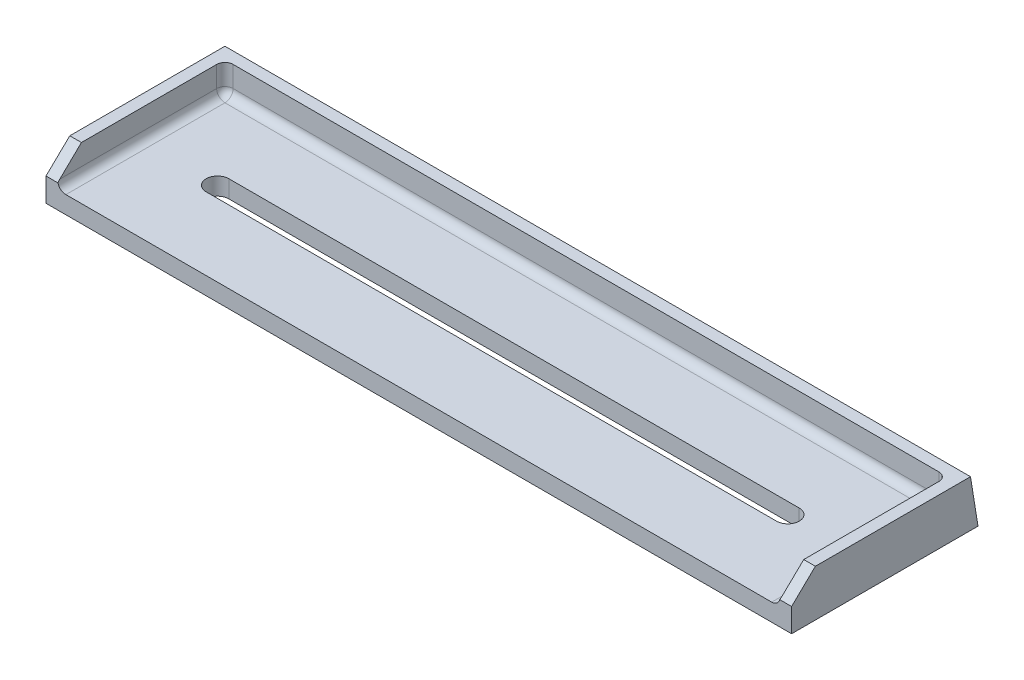
ISO-10303-21;
HEADER;
FILE_DESCRIPTION(('STEP AP214'),'2;1');
FILE_NAME('part.step','',(''),(''),'','','');
FILE_SCHEMA(('AUTOMOTIVE_DESIGN { 1 0 10303 214 1 1 1 1 }'));
ENDSEC;
DATA;
#1=APPLICATION_CONTEXT('core data for automotive mechanical design processes');
#2=APPLICATION_PROTOCOL_DEFINITION('international standard','automotive_design',2000,#1);
#3=PRODUCT_CONTEXT('',#1,'mechanical');
#4=PRODUCT('Part','Part','',(#3));
#5=PRODUCT_RELATED_PRODUCT_CATEGORY('part','',(#4));
#6=PRODUCT_DEFINITION_FORMATION('','',#4);
#7=PRODUCT_DEFINITION_CONTEXT('part definition',#1,'design');
#8=PRODUCT_DEFINITION('design','',#6,#7);
#9=PRODUCT_DEFINITION_SHAPE('','',#8);
#10=(LENGTH_UNIT() NAMED_UNIT(*) SI_UNIT(.MILLI.,.METRE.));
#11=(NAMED_UNIT(*) PLANE_ANGLE_UNIT() SI_UNIT($,.RADIAN.));
#12=(NAMED_UNIT(*) SI_UNIT($,.STERADIAN.) SOLID_ANGLE_UNIT());
#13=UNCERTAINTY_MEASURE_WITH_UNIT(LENGTH_MEASURE(1.E-05),#10,'distance_accuracy_value','');
#14=(GEOMETRIC_REPRESENTATION_CONTEXT(3) GLOBAL_UNCERTAINTY_ASSIGNED_CONTEXT((#13)) GLOBAL_UNIT_ASSIGNED_CONTEXT((#10,
#11,#12)) REPRESENTATION_CONTEXT('',''));
#15=CARTESIAN_POINT('',(0.,0.,0.));
#16=DIRECTION('',(0.,0.,1.));
#17=DIRECTION('',(1.,0.,0.));
#18=AXIS2_PLACEMENT_3D('',#15,#16,#17);
#19=CARTESIAN_POINT('',(-50.8,6.35,12.7));
#20=DIRECTION('',(1.,0.,0.));
#21=DIRECTION('',(0.,0.,-1.));
#22=AXIS2_PLACEMENT_3D('',#19,#20,#21);
#23=PLANE('',#22);
#24=DIRECTION('',(0.,-1.,0.));
#25=VECTOR('',#24,1.);
#26=CARTESIAN_POINT('',(-50.8,6.35,12.7));
#27=LINE('',#26,#25);
#28=CARTESIAN_POINT('',(-50.8,3.22326,12.7));
#29=VERTEX_POINT('',#28);
#30=CARTESIAN_POINT('',(-50.8,0.,12.7));
#31=VERTEX_POINT('',#30);
#32=EDGE_CURVE('E183',#29,#31,#27,.T.);
#33=ORIENTED_EDGE('',*,*,#32,.F.);
#34=DIRECTION('',(0.,0.694302557027958,-0.719683235392099));
#35=VECTOR('',#34,1.);
#36=CARTESIAN_POINT('',(-50.8,6.35,9.45896));
#37=LINE('',#36,#35);
#38=CARTESIAN_POINT('',(-50.8,6.35,9.45896));
#39=VERTEX_POINT('',#38);
#40=EDGE_CURVE('E254',#29,#39,#37,.T.);
#41=ORIENTED_EDGE('',*,*,#40,.T.);
#42=DIRECTION('',(0.,0.,1.));
#43=VECTOR('',#42,1.);
#44=CARTESIAN_POINT('',(-50.8,6.35,12.7));
#45=LINE('',#44,#43);
#46=CARTESIAN_POINT('',(-50.8,6.35,-11.67892));
#47=VERTEX_POINT('',#46);
#48=EDGE_CURVE('E181',#47,#39,#45,.T.);
#49=ORIENTED_EDGE('',*,*,#48,.F.);
#50=DIRECTION('',(0.,0.987317109484192,0.158760591205058));
#51=VECTOR('',#50,1.);
#52=CARTESIAN_POINT('',(-50.8,0.,-12.7));
#53=LINE('',#52,#51);
#54=CARTESIAN_POINT('',(-50.8,0.,-12.7));
#55=VERTEX_POINT('',#54);
#56=EDGE_CURVE('E298',#55,#47,#53,.T.);
#57=ORIENTED_EDGE('',*,*,#56,.F.);
#58=DIRECTION('',(0.,0.,1.));
#59=VECTOR('',#58,1.);
#60=CARTESIAN_POINT('',(-50.8,0.,12.7));
#61=LINE('',#60,#59);
#62=EDGE_CURVE('E190',#55,#31,#61,.T.);
#63=ORIENTED_EDGE('',*,*,#62,.T.);
#64=EDGE_LOOP('',(#33,#41,#49,#57,#63));
#65=FACE_BOUND('',#64,.T.);
#66=ADVANCED_FACE('F32',(#65),#23,.F.);
#67=CARTESIAN_POINT('',(50.8,6.35,12.7));
#68=DIRECTION('',(0.,0.,-1.));
#69=DIRECTION('',(-1.,0.,0.));
#70=AXIS2_PLACEMENT_3D('',#67,#68,#69);
#71=PLANE('',#70);
#72=DIRECTION('',(0.,-1.,0.));
#73=VECTOR('',#72,1.);
#74=CARTESIAN_POINT('',(50.8,6.35,12.7));
#75=LINE('',#74,#73);
#76=CARTESIAN_POINT('',(50.8,3.22326,12.7));
#77=VERTEX_POINT('',#76);
#78=CARTESIAN_POINT('',(50.8,0.,12.7));
#79=VERTEX_POINT('',#78);
#80=EDGE_CURVE('E180',#77,#79,#75,.T.);
#81=ORIENTED_EDGE('',*,*,#80,.F.);
#82=DIRECTION('',(-1.,0.,0.));
#83=VECTOR('',#82,1.);
#84=CARTESIAN_POINT('',(50.8,3.22326,12.7));
#85=LINE('',#84,#83);
#86=CARTESIAN_POINT('',(49.1765215316084,3.22326,12.7));
#87=VERTEX_POINT('',#86);
#88=EDGE_CURVE('E56',#77,#87,#85,.T.);
#89=ORIENTED_EDGE('',*,*,#88,.T.);
#90=CARTESIAN_POINT('',(48.08982,3.5052,12.7));
#91=DIRECTION('',(0.,0.,-1.));
#92=DIRECTION('',(-1.,0.,0.));
#93=AXIS2_PLACEMENT_3D('',#90,#91,#92);
#94=CIRCLE('',#93,1.12268);
#95=CARTESIAN_POINT('',(48.08982,2.38252,12.7));
#96=VERTEX_POINT('',#95);
#97=EDGE_CURVE('E226',#87,#96,#94,.T.);
#98=ORIENTED_EDGE('',*,*,#97,.T.);
#99=DIRECTION('',(1.,0.,0.));
#100=VECTOR('',#99,1.);
#101=CARTESIAN_POINT('',(-49.2125,2.38252,12.7));
#102=LINE('',#101,#100);
#103=CARTESIAN_POINT('',(-48.08982,2.38252,12.7));
#104=VERTEX_POINT('',#103);
#105=EDGE_CURVE('E295',#104,#96,#102,.T.);
#106=ORIENTED_EDGE('',*,*,#105,.F.);
#107=CARTESIAN_POINT('',(-48.08982,3.5052,12.7));
#108=DIRECTION('',(0.,0.,-1.));
#109=DIRECTION('',(-1.,0.,0.));
#110=AXIS2_PLACEMENT_3D('',#107,#108,#109);
#111=CIRCLE('',#110,1.12268);
#112=CARTESIAN_POINT('',(-49.1765215316084,3.22326,12.7));
#113=VERTEX_POINT('',#112);
#114=EDGE_CURVE('E41',#104,#113,#111,.T.);
#115=ORIENTED_EDGE('',*,*,#114,.T.);
#116=DIRECTION('',(1.,0.,0.));
#117=VECTOR('',#116,1.);
#118=CARTESIAN_POINT('',(-50.8,3.22326,12.7));
#119=LINE('',#118,#117);
#120=EDGE_CURVE('E48',#29,#113,#119,.T.);
#121=ORIENTED_EDGE('',*,*,#120,.F.);
#122=ORIENTED_EDGE('',*,*,#32,.T.);
#123=DIRECTION('',(1.,0.,0.));
#124=VECTOR('',#123,1.);
#125=CARTESIAN_POINT('',(50.8,0.,12.7));
#126=LINE('',#125,#124);
#127=EDGE_CURVE('E193',#31,#79,#126,.T.);
#128=ORIENTED_EDGE('',*,*,#127,.T.);
#129=EDGE_LOOP('',(#81,#89,#98,#106,#115,#121,#122,#128));
#130=FACE_BOUND('',#129,.T.);
#131=ADVANCED_FACE('F313',(#130),#71,.F.);
#132=CARTESIAN_POINT('',(50.8,6.35,12.7));
#133=DIRECTION('',(-1.,0.,0.));
#134=DIRECTION('',(0.,0.,1.));
#135=AXIS2_PLACEMENT_3D('',#132,#133,#134);
#136=PLANE('',#135);
#137=DIRECTION('',(0.,0.,-1.));
#138=VECTOR('',#137,1.);
#139=CARTESIAN_POINT('',(50.8,6.35,12.7));
#140=LINE('',#139,#138);
#141=CARTESIAN_POINT('',(50.8,6.35,9.45895999999999));
#142=VERTEX_POINT('',#141);
#143=CARTESIAN_POINT('',(50.8,6.35,-11.67892));
#144=VERTEX_POINT('',#143);
#145=EDGE_CURVE('E171',#142,#144,#140,.T.);
#146=ORIENTED_EDGE('',*,*,#145,.F.);
#147=DIRECTION('',(0.,-0.694302557027956,0.719683235392101));
#148=VECTOR('',#147,1.);
#149=CARTESIAN_POINT('',(50.8,6.35,9.45895999999999));
#150=LINE('',#149,#148);
#151=EDGE_CURVE('E157',#142,#77,#150,.T.);
#152=ORIENTED_EDGE('',*,*,#151,.T.);
#153=ORIENTED_EDGE('',*,*,#80,.T.);
#154=DIRECTION('',(0.,0.,-1.));
#155=VECTOR('',#154,1.);
#156=CARTESIAN_POINT('',(50.8,0.,12.7));
#157=LINE('',#156,#155);
#158=CARTESIAN_POINT('',(50.8,0.,-12.7));
#159=VERTEX_POINT('',#158);
#160=EDGE_CURVE('E197',#79,#159,#157,.T.);
#161=ORIENTED_EDGE('',*,*,#160,.T.);
#162=DIRECTION('',(0.,0.987317109484192,0.158760591205058));
#163=VECTOR('',#162,1.);
#164=CARTESIAN_POINT('',(50.8,0.,-12.7));
#165=LINE('',#164,#163);
#166=EDGE_CURVE('E179',#159,#144,#165,.T.);
#167=ORIENTED_EDGE('',*,*,#166,.T.);
#168=EDGE_LOOP('',(#146,#152,#153,#161,#167));
#169=FACE_BOUND('',#168,.T.);
#170=ADVANCED_FACE('F177',(#169),#136,.F.);
#171=CARTESIAN_POINT('',(0.,6.35,0.));
#172=DIRECTION('',(0.,1.,0.));
#173=DIRECTION('',(0.,0.,1.));
#174=AXIS2_PLACEMENT_3D('',#171,#172,#173);
#175=PLANE('',#174);
#176=DIRECTION('',(-1.,0.,0.));
#177=VECTOR('',#176,1.);
#178=CARTESIAN_POINT('',(50.8,6.35,9.45895999999999));
#179=LINE('',#178,#177);
#180=CARTESIAN_POINT('',(49.2125,6.35,9.45895999999999));
#181=VERTEX_POINT('',#180);
#182=EDGE_CURVE('E161',#142,#181,#179,.T.);
#183=ORIENTED_EDGE('',*,*,#182,.F.);
#184=ORIENTED_EDGE('',*,*,#145,.T.);
#185=DIRECTION('',(-1.,0.,0.));
#186=VECTOR('',#185,1.);
#187=CARTESIAN_POINT('',(50.8,6.35,-11.67892));
#188=LINE('',#187,#186);
#189=EDGE_CURVE('E194',#144,#47,#188,.T.);
#190=ORIENTED_EDGE('',*,*,#189,.T.);
#191=ORIENTED_EDGE('',*,*,#48,.T.);
#192=DIRECTION('',(1.,0.,0.));
#193=VECTOR('',#192,1.);
#194=CARTESIAN_POINT('',(-50.8,6.35,9.45896));
#195=LINE('',#194,#193);
#196=CARTESIAN_POINT('',(-49.2125,6.35,9.45896));
#197=VERTEX_POINT('',#196);
#198=EDGE_CURVE('E258',#39,#197,#195,.T.);
#199=ORIENTED_EDGE('',*,*,#198,.T.);
#200=DIRECTION('',(0.,0.,1.));
#201=VECTOR('',#200,1.);
#202=CARTESIAN_POINT('',(-49.2125,6.35,12.7));
#203=LINE('',#202,#201);
#204=CARTESIAN_POINT('',(-49.2125,6.35,-8.96874));
#205=VERTEX_POINT('',#204);
#206=EDGE_CURVE('E294',#205,#197,#203,.T.);
#207=ORIENTED_EDGE('',*,*,#206,.F.);
#208=CARTESIAN_POINT('',(-48.08982,6.35,-8.96874));
#209=DIRECTION('',(0.,1.,0.));
#210=DIRECTION('',(0.,0.,1.));
#211=AXIS2_PLACEMENT_3D('',#208,#209,#210);
#212=CIRCLE('',#211,1.12268);
#213=CARTESIAN_POINT('',(-48.08982,6.35,-10.09142));
#214=VERTEX_POINT('',#213);
#215=EDGE_CURVE('E228',#205,#214,#212,.F.);
#216=ORIENTED_EDGE('',*,*,#215,.T.);
#217=DIRECTION('',(-1.,0.,0.));
#218=VECTOR('',#217,1.);
#219=CARTESIAN_POINT('',(-49.2125,6.35,-10.09142));
#220=LINE('',#219,#218);
#221=CARTESIAN_POINT('',(48.08982,6.35,-10.09142));
#222=VERTEX_POINT('',#221);
#223=EDGE_CURVE('E299',#222,#214,#220,.T.);
#224=ORIENTED_EDGE('',*,*,#223,.F.);
#225=CARTESIAN_POINT('',(48.08982,6.35,-8.96874));
#226=DIRECTION('',(0.,1.,0.));
#227=DIRECTION('',(0.,0.,1.));
#228=AXIS2_PLACEMENT_3D('',#225,#226,#227);
#229=CIRCLE('',#228,1.12268);
#230=CARTESIAN_POINT('',(49.2125,6.35,-8.96874));
#231=VERTEX_POINT('',#230);
#232=EDGE_CURVE('E222',#222,#231,#229,.F.);
#233=ORIENTED_EDGE('',*,*,#232,.T.);
#234=DIRECTION('',(0.,0.,-1.));
#235=VECTOR('',#234,1.);
#236=CARTESIAN_POINT('',(49.2125,6.35,12.7));
#237=LINE('',#236,#235);
#238=EDGE_CURVE('E174',#181,#231,#237,.T.);
#239=ORIENTED_EDGE('',*,*,#238,.F.);
#240=EDGE_LOOP('',(#183,#184,#190,#191,#199,#207,#216,#224,#233,#239));
#241=FACE_BOUND('',#240,.T.);
#242=ADVANCED_FACE('F169',(#241),#175,.T.);
#243=CARTESIAN_POINT('',(0.,0.,0.));
#244=DIRECTION('',(0.,1.,0.));
#245=DIRECTION('',(0.,0.,1.));
#246=AXIS2_PLACEMENT_3D('',#243,#244,#245);
#247=PLANE('',#246);
#248=DIRECTION('',(-1.,0.,0.));
#249=VECTOR('',#248,1.);
#250=CARTESIAN_POINT('',(0.,0.,-0.278654724835411));
#251=LINE('',#250,#249);
#252=CARTESIAN_POINT('',(38.862,0.,-0.278654724835408));
#253=VERTEX_POINT('',#252);
#254=CARTESIAN_POINT('',(-38.862,0.,-0.278654724835411));
#255=VERTEX_POINT('',#254);
#256=EDGE_CURVE('E288',#253,#255,#251,.T.);
#257=ORIENTED_EDGE('',*,*,#256,.T.);
#258=CARTESIAN_POINT('',(-38.862,0.,1.27));
#259=DIRECTION('',(0.,1.,0.));
#260=DIRECTION('',(0.,0.,1.));
#261=AXIS2_PLACEMENT_3D('',#258,#259,#260);
#262=CIRCLE('',#261,1.54865472483541);
#263=CARTESIAN_POINT('',(-38.862,0.,2.81865472483541));
#264=VERTEX_POINT('',#263);
#265=EDGE_CURVE('E291',#255,#264,#262,.T.);
#266=ORIENTED_EDGE('',*,*,#265,.T.);
#267=DIRECTION('',(1.,0.,0.));
#268=VECTOR('',#267,1.);
#269=CARTESIAN_POINT('',(0.,0.,2.81865472483541));
#270=LINE('',#269,#268);
#271=CARTESIAN_POINT('',(38.862,0.,2.81865472483541));
#272=VERTEX_POINT('',#271);
#273=EDGE_CURVE('E276',#264,#272,#270,.T.);
#274=ORIENTED_EDGE('',*,*,#273,.T.);
#275=CARTESIAN_POINT('',(38.862,0.,1.27));
#276=DIRECTION('',(0.,1.,0.));
#277=DIRECTION('',(0.,0.,1.));
#278=AXIS2_PLACEMENT_3D('',#275,#276,#277);
#279=CIRCLE('',#278,1.54865472483541);
#280=EDGE_CURVE('E285',#272,#253,#279,.T.);
#281=ORIENTED_EDGE('',*,*,#280,.T.);
#282=EDGE_LOOP('',(#257,#266,#274,#281));
#283=FACE_BOUND('',#282,.T.);
#284=ORIENTED_EDGE('',*,*,#62,.F.);
#285=DIRECTION('',(-1.,0.,0.));
#286=VECTOR('',#285,1.);
#287=CARTESIAN_POINT('',(50.8,0.,-12.7));
#288=LINE('',#287,#286);
#289=EDGE_CURVE('E186',#159,#55,#288,.T.);
#290=ORIENTED_EDGE('',*,*,#289,.F.);
#291=ORIENTED_EDGE('',*,*,#160,.F.);
#292=ORIENTED_EDGE('',*,*,#127,.F.);
#293=EDGE_LOOP('',(#284,#290,#291,#292));
#294=FACE_BOUND('',#293,.T.);
#295=ADVANCED_FACE('F503',(#283,#294),#247,.F.);
#296=CARTESIAN_POINT('',(50.8,0.,-12.7));
#297=DIRECTION('',(0.,-0.158760591205058,0.987317109484192));
#298=DIRECTION('',(0.,-0.987317109484192,-0.158760591205058));
#299=AXIS2_PLACEMENT_3D('',#296,#297,#298);
#300=PLANE('',#299);
#301=ORIENTED_EDGE('',*,*,#56,.T.);
#302=ORIENTED_EDGE('',*,*,#189,.F.);
#303=ORIENTED_EDGE('',*,*,#166,.F.);
#304=ORIENTED_EDGE('',*,*,#289,.T.);
#305=EDGE_LOOP('',(#301,#302,#303,#304));
#306=FACE_BOUND('',#305,.T.);
#307=ADVANCED_FACE('F494',(#306),#300,.F.);
#308=CARTESIAN_POINT('',(-49.2125,2.38252,12.7));
#309=DIRECTION('',(-1.,0.,0.));
#310=DIRECTION('',(0.,0.,1.));
#311=AXIS2_PLACEMENT_3D('',#308,#309,#310);
#312=PLANE('',#311);
#313=DIRECTION('',(0.,0.,1.));
#314=VECTOR('',#313,1.);
#315=CARTESIAN_POINT('',(-49.2125,3.5052,-10.09142));
#316=LINE('',#315,#314);
#317=CARTESIAN_POINT('',(-49.2125,3.5052,12.4077535012185));
#318=VERTEX_POINT('',#317);
#319=CARTESIAN_POINT('',(-49.2125,3.5052,-8.96874));
#320=VERTEX_POINT('',#319);
#321=EDGE_CURVE('E218',#318,#320,#316,.F.);
#322=ORIENTED_EDGE('',*,*,#321,.T.);
#323=DIRECTION('',(0.,1.,0.));
#324=VECTOR('',#323,1.);
#325=CARTESIAN_POINT('',(-49.2125,6.35,-8.96874));
#326=LINE('',#325,#324);
#327=EDGE_CURVE('E220',#320,#205,#326,.T.);
#328=ORIENTED_EDGE('',*,*,#327,.T.);
#329=ORIENTED_EDGE('',*,*,#206,.T.);
#330=DIRECTION('',(0.,0.694302557027958,-0.719683235392099));
#331=VECTOR('',#330,1.);
#332=CARTESIAN_POINT('',(-49.2125,6.35,9.45896));
#333=LINE('',#332,#331);
#334=EDGE_CURVE('E252',#318,#197,#333,.T.);
#335=ORIENTED_EDGE('',*,*,#334,.F.);
#336=EDGE_LOOP('',(#322,#328,#329,#335));
#337=FACE_BOUND('',#336,.T.);
#338=ADVANCED_FACE('F323',(#337),#312,.F.);
#339=CARTESIAN_POINT('',(-49.2125,2.38252,-10.09142));
#340=DIRECTION('',(0.,0.,-1.));
#341=DIRECTION('',(-1.,0.,0.));
#342=AXIS2_PLACEMENT_3D('',#339,#340,#341);
#343=PLANE('',#342);
#344=DIRECTION('',(-1.,0.,0.));
#345=VECTOR('',#344,1.);
#346=CARTESIAN_POINT('',(49.2125,3.5052,-10.09142));
#347=LINE('',#346,#345);
#348=CARTESIAN_POINT('',(-48.08982,3.5052,-10.09142));
#349=VERTEX_POINT('',#348);
#350=CARTESIAN_POINT('',(48.08982,3.5052,-10.09142));
#351=VERTEX_POINT('',#350);
#352=EDGE_CURVE('E201',#349,#351,#347,.F.);
#353=ORIENTED_EDGE('',*,*,#352,.T.);
#354=DIRECTION('',(0.,1.,0.));
#355=VECTOR('',#354,1.);
#356=CARTESIAN_POINT('',(48.08982,6.35,-10.09142));
#357=LINE('',#356,#355);
#358=EDGE_CURVE('E205',#351,#222,#357,.T.);
#359=ORIENTED_EDGE('',*,*,#358,.T.);
#360=ORIENTED_EDGE('',*,*,#223,.T.);
#361=DIRECTION('',(0.,1.,0.));
#362=VECTOR('',#361,1.);
#363=CARTESIAN_POINT('',(-48.08982,2.38252,-10.09142));
#364=LINE('',#363,#362);
#365=EDGE_CURVE('E203',#214,#349,#364,.F.);
#366=ORIENTED_EDGE('',*,*,#365,.T.);
#367=EDGE_LOOP('',(#353,#359,#360,#366));
#368=FACE_BOUND('',#367,.T.);
#369=ADVANCED_FACE('F332',(#368),#343,.F.);
#370=CARTESIAN_POINT('',(49.2125,2.38252,12.7));
#371=DIRECTION('',(1.,0.,0.));
#372=DIRECTION('',(0.,0.,-1.));
#373=AXIS2_PLACEMENT_3D('',#370,#371,#372);
#374=PLANE('',#373);
#375=ORIENTED_EDGE('',*,*,#238,.T.);
#376=DIRECTION('',(0.,1.,0.));
#377=VECTOR('',#376,1.);
#378=CARTESIAN_POINT('',(49.2125,2.38252,-8.96874));
#379=LINE('',#378,#377);
#380=CARTESIAN_POINT('',(49.2125,3.5052,-8.96874));
#381=VERTEX_POINT('',#380);
#382=EDGE_CURVE('E210',#231,#381,#379,.F.);
#383=ORIENTED_EDGE('',*,*,#382,.T.);
#384=DIRECTION('',(0.,0.,-1.));
#385=VECTOR('',#384,1.);
#386=CARTESIAN_POINT('',(49.2125,3.5052,12.7));
#387=LINE('',#386,#385);
#388=CARTESIAN_POINT('',(49.2125,3.5052,12.4077535012185));
#389=VERTEX_POINT('',#388);
#390=EDGE_CURVE('E208',#381,#389,#387,.F.);
#391=ORIENTED_EDGE('',*,*,#390,.T.);
#392=DIRECTION('',(0.,-0.694302557027956,0.719683235392101));
#393=VECTOR('',#392,1.);
#394=CARTESIAN_POINT('',(49.2125,6.35,9.45895999999999));
#395=LINE('',#394,#393);
#396=EDGE_CURVE('E165',#181,#389,#395,.T.);
#397=ORIENTED_EDGE('',*,*,#396,.F.);
#398=EDGE_LOOP('',(#375,#383,#391,#397));
#399=FACE_BOUND('',#398,.T.);
#400=ADVANCED_FACE('F339',(#399),#374,.F.);
#401=CARTESIAN_POINT('',(0.,2.38252,0.));
#402=DIRECTION('',(0.,-1.,0.));
#403=DIRECTION('',(0.,0.,-1.));
#404=AXIS2_PLACEMENT_3D('',#401,#402,#403);
#405=PLANE('',#404);
#406=ORIENTED_EDGE('',*,*,#105,.T.);
#407=DIRECTION('',(0.,0.,-1.));
#408=VECTOR('',#407,1.);
#409=CARTESIAN_POINT('',(48.08982,2.38252,-10.09142));
#410=LINE('',#409,#408);
#411=CARTESIAN_POINT('',(48.08982,2.38252,-8.96874));
#412=VERTEX_POINT('',#411);
#413=EDGE_CURVE('E216',#96,#412,#410,.T.);
#414=ORIENTED_EDGE('',*,*,#413,.T.);
#415=DIRECTION('',(-1.,0.,0.));
#416=VECTOR('',#415,1.);
#417=CARTESIAN_POINT('',(-49.2125,2.38252,-8.96874));
#418=LINE('',#417,#416);
#419=CARTESIAN_POINT('',(-48.08982,2.38252,-8.96874));
#420=VERTEX_POINT('',#419);
#421=EDGE_CURVE('E212',#412,#420,#418,.T.);
#422=ORIENTED_EDGE('',*,*,#421,.T.);
#423=DIRECTION('',(0.,0.,1.));
#424=VECTOR('',#423,1.);
#425=CARTESIAN_POINT('',(-48.08982,2.38252,12.7));
#426=LINE('',#425,#424);
#427=EDGE_CURVE('E214',#420,#104,#426,.T.);
#428=ORIENTED_EDGE('',*,*,#427,.T.);
#429=EDGE_LOOP('',(#406,#414,#422,#428));
#430=FACE_BOUND('',#429,.T.);
#431=DIRECTION('',(1.,0.,0.));
#432=VECTOR('',#431,1.);
#433=CARTESIAN_POINT('',(-38.862,2.38252,2.81865472483541));
#434=LINE('',#433,#432);
#435=CARTESIAN_POINT('',(-38.862,2.38252,2.81865472483541));
#436=VERTEX_POINT('',#435);
#437=CARTESIAN_POINT('',(38.862,2.38252,2.81865472483541));
#438=VERTEX_POINT('',#437);
#439=EDGE_CURVE('E264',#436,#438,#434,.T.);
#440=ORIENTED_EDGE('',*,*,#439,.F.);
#441=CARTESIAN_POINT('',(-38.862,2.38252,1.27));
#442=DIRECTION('',(0.,1.,0.));
#443=DIRECTION('',(0.,0.,1.));
#444=AXIS2_PLACEMENT_3D('',#441,#442,#443);
#445=CIRCLE('',#444,1.54865472483541);
#446=CARTESIAN_POINT('',(-38.862,2.38252,-0.278654724835411));
#447=VERTEX_POINT('',#446);
#448=EDGE_CURVE('E261',#447,#436,#445,.T.);
#449=ORIENTED_EDGE('',*,*,#448,.F.);
#450=DIRECTION('',(-1.,0.,0.));
#451=VECTOR('',#450,1.);
#452=CARTESIAN_POINT('',(-38.862,2.38252,-0.278654724835411));
#453=LINE('',#452,#451);
#454=CARTESIAN_POINT('',(38.862,2.38252,-0.278654724835408));
#455=VERTEX_POINT('',#454);
#456=EDGE_CURVE('E270',#455,#447,#453,.T.);
#457=ORIENTED_EDGE('',*,*,#456,.F.);
#458=CARTESIAN_POINT('',(38.862,2.38252,1.27));
#459=DIRECTION('',(0.,1.,0.));
#460=DIRECTION('',(0.,0.,1.));
#461=AXIS2_PLACEMENT_3D('',#458,#459,#460);
#462=CIRCLE('',#461,1.54865472483541);
#463=EDGE_CURVE('E267',#438,#455,#462,.T.);
#464=ORIENTED_EDGE('',*,*,#463,.F.);
#465=EDGE_LOOP('',(#440,#449,#457,#464));
#466=FACE_BOUND('',#465,.T.);
#467=ADVANCED_FACE('F351',(#430,#466),#405,.F.);
#468=CARTESIAN_POINT('',(-38.862,-0.15748,1.27));
#469=DIRECTION('',(0.,1.,0.));
#470=DIRECTION('',(0.,0.,1.));
#471=AXIS2_PLACEMENT_3D('',#468,#469,#470);
#472=CYLINDRICAL_SURFACE('',#471,1.54865472483541);
#473=DIRECTION('',(0.,1.,0.));
#474=VECTOR('',#473,1.);
#475=CARTESIAN_POINT('',(-38.862,-0.15748,-0.278654724835411));
#476=LINE('',#475,#474);
#477=EDGE_CURVE('E274',#255,#447,#476,.T.);
#478=ORIENTED_EDGE('',*,*,#477,.T.);
#479=ORIENTED_EDGE('',*,*,#448,.T.);
#480=DIRECTION('',(0.,1.,0.));
#481=VECTOR('',#480,1.);
#482=CARTESIAN_POINT('',(-38.862,-0.15748,2.81865472483541));
#483=LINE('',#482,#481);
#484=EDGE_CURVE('E273',#264,#436,#483,.T.);
#485=ORIENTED_EDGE('',*,*,#484,.F.);
#486=ORIENTED_EDGE('',*,*,#265,.F.);
#487=EDGE_LOOP('',(#478,#479,#485,#486));
#488=FACE_BOUND('',#487,.T.);
#489=ADVANCED_FACE('F456',(#488),#472,.F.);
#490=CARTESIAN_POINT('',(-38.862,-0.15748,-0.278654724835411));
#491=DIRECTION('',(0.,0.,-1.));
#492=DIRECTION('',(-1.,0.,0.));
#493=AXIS2_PLACEMENT_3D('',#490,#491,#492);
#494=PLANE('',#493);
#495=DIRECTION('',(0.,1.,0.));
#496=VECTOR('',#495,1.);
#497=CARTESIAN_POINT('',(38.862,-0.15748,-0.278654724835408));
#498=LINE('',#497,#496);
#499=EDGE_CURVE('E277',#253,#455,#498,.T.);
#500=ORIENTED_EDGE('',*,*,#499,.T.);
#501=ORIENTED_EDGE('',*,*,#456,.T.);
#502=ORIENTED_EDGE('',*,*,#477,.F.);
#503=ORIENTED_EDGE('',*,*,#256,.F.);
#504=EDGE_LOOP('',(#500,#501,#502,#503));
#505=FACE_BOUND('',#504,.T.);
#506=ADVANCED_FACE('F447',(#505),#494,.F.);
#507=CARTESIAN_POINT('',(38.862,-0.15748,1.27));
#508=DIRECTION('',(0.,1.,0.));
#509=DIRECTION('',(0.,0.,1.));
#510=AXIS2_PLACEMENT_3D('',#507,#508,#509);
#511=CYLINDRICAL_SURFACE('',#510,1.54865472483541);
#512=DIRECTION('',(0.,1.,0.));
#513=VECTOR('',#512,1.);
#514=CARTESIAN_POINT('',(38.862,-0.15748,2.81865472483541));
#515=LINE('',#514,#513);
#516=EDGE_CURVE('E279',#272,#438,#515,.T.);
#517=ORIENTED_EDGE('',*,*,#516,.T.);
#518=ORIENTED_EDGE('',*,*,#463,.T.);
#519=ORIENTED_EDGE('',*,*,#499,.F.);
#520=ORIENTED_EDGE('',*,*,#280,.F.);
#521=EDGE_LOOP('',(#517,#518,#519,#520));
#522=FACE_BOUND('',#521,.T.);
#523=ADVANCED_FACE('F438',(#522),#511,.F.);
#524=CARTESIAN_POINT('',(-38.862,-0.15748,2.81865472483541));
#525=DIRECTION('',(0.,0.,1.));
#526=DIRECTION('',(1.,0.,0.));
#527=AXIS2_PLACEMENT_3D('',#524,#525,#526);
#528=PLANE('',#527);
#529=ORIENTED_EDGE('',*,*,#484,.T.);
#530=ORIENTED_EDGE('',*,*,#439,.T.);
#531=ORIENTED_EDGE('',*,*,#516,.F.);
#532=ORIENTED_EDGE('',*,*,#273,.F.);
#533=EDGE_LOOP('',(#529,#530,#531,#532));
#534=FACE_BOUND('',#533,.T.);
#535=ADVANCED_FACE('F429',(#534),#528,.F.);
#536=CARTESIAN_POINT('',(-50.8,6.35,9.45896));
#537=DIRECTION('',(0.,-0.719683235392099,-0.694302557027958));
#538=DIRECTION('',(0.,0.694302557027958,-0.719683235392099));
#539=AXIS2_PLACEMENT_3D('',#536,#537,#538);
#540=PLANE('',#539);
#541=ORIENTED_EDGE('',*,*,#120,.T.);
#542=CARTESIAN_POINT('',(-48.08982,3.5052,12.4077535012185));
#543=DIRECTION('',(0.,-0.719683235392099,-0.694302557027958));
#544=DIRECTION('',(0.,0.694302557027958,-0.719683235392099));
#545=AXIS2_PLACEMENT_3D('',#542,#543,#544);
#546=ELLIPSE('',#545,1.61698957988252,1.12268);
#547=EDGE_CURVE('E11',#113,#318,#546,.T.);
#548=ORIENTED_EDGE('',*,*,#547,.T.);
#549=ORIENTED_EDGE('',*,*,#334,.T.);
#550=ORIENTED_EDGE('',*,*,#198,.F.);
#551=ORIENTED_EDGE('',*,*,#40,.F.);
#552=EDGE_LOOP('',(#541,#548,#549,#550,#551));
#553=FACE_BOUND('',#552,.T.);
#554=ADVANCED_FACE('F312',(#553),#540,.F.);
#555=CARTESIAN_POINT('',(50.8,6.35,9.45895999999999));
#556=DIRECTION('',(0.,-0.719683235392101,-0.694302557027956));
#557=DIRECTION('',(0.,0.694302557027956,-0.719683235392101));
#558=AXIS2_PLACEMENT_3D('',#555,#556,#557);
#559=PLANE('',#558);
#560=ORIENTED_EDGE('',*,*,#396,.T.);
#561=CARTESIAN_POINT('',(48.08982,3.5052,12.4077535012185));
#562=DIRECTION('',(0.,-0.719683235392101,-0.694302557027956));
#563=DIRECTION('',(0.,-0.694302557027956,0.719683235392101));
#564=AXIS2_PLACEMENT_3D('',#561,#562,#563);
#565=ELLIPSE('',#564,1.61698957988253,1.12268);
#566=EDGE_CURVE('E224',#389,#87,#565,.T.);
#567=ORIENTED_EDGE('',*,*,#566,.T.);
#568=ORIENTED_EDGE('',*,*,#88,.F.);
#569=ORIENTED_EDGE('',*,*,#151,.F.);
#570=ORIENTED_EDGE('',*,*,#182,.T.);
#571=EDGE_LOOP('',(#560,#567,#568,#569,#570));
#572=FACE_BOUND('',#571,.T.);
#573=ADVANCED_FACE('F160',(#572),#559,.F.);
#574=CARTESIAN_POINT('',(-48.08982,3.5052,0.));
#575=DIRECTION('',(0.,0.,-1.));
#576=DIRECTION('',(-1.,0.,0.));
#577=AXIS2_PLACEMENT_3D('',#574,#575,#576);
#578=CYLINDRICAL_SURFACE('',#577,1.12268);
#579=ORIENTED_EDGE('',*,*,#114,.F.);
#580=ORIENTED_EDGE('',*,*,#427,.F.);
#581=CARTESIAN_POINT('',(-48.08982,3.5052,-8.96874));
#582=DIRECTION('',(0.,0.,1.));
#583=DIRECTION('',(0.,-1.,0.));
#584=AXIS2_PLACEMENT_3D('',#581,#582,#583);
#585=CIRCLE('',#584,1.12268);
#586=EDGE_CURVE('E36',#320,#420,#585,.T.);
#587=ORIENTED_EDGE('',*,*,#586,.F.);
#588=ORIENTED_EDGE('',*,*,#321,.F.);
#589=ORIENTED_EDGE('',*,*,#547,.F.);
#590=EDGE_LOOP('',(#579,#580,#587,#588,#589));
#591=FACE_BOUND('',#590,.T.);
#592=ADVANCED_FACE('F34',(#591),#578,.F.);
#593=CARTESIAN_POINT('',(-48.08982,2.38252,-8.96874));
#594=DIRECTION('',(0.,-1.,0.));
#595=DIRECTION('',(0.,0.,-1.));
#596=AXIS2_PLACEMENT_3D('',#593,#594,#595);
#597=CYLINDRICAL_SURFACE('',#596,1.12268);
#598=ORIENTED_EDGE('',*,*,#215,.F.);
#599=ORIENTED_EDGE('',*,*,#327,.F.);
#600=CARTESIAN_POINT('',(-48.08982,3.5052,-8.96874));
#601=DIRECTION('',(0.,1.,0.));
#602=DIRECTION('',(0.,0.,1.));
#603=AXIS2_PLACEMENT_3D('',#600,#601,#602);
#604=CIRCLE('',#603,1.12268);
#605=EDGE_CURVE('E242',#349,#320,#604,.T.);
#606=ORIENTED_EDGE('',*,*,#605,.F.);
#607=ORIENTED_EDGE('',*,*,#365,.F.);
#608=EDGE_LOOP('',(#598,#599,#606,#607));
#609=FACE_BOUND('',#608,.T.);
#610=ADVANCED_FACE('F330',(#609),#597,.F.);
#611=CARTESIAN_POINT('',(-48.08982,3.5052,-8.96874));
#612=DIRECTION('',(0.,0.,1.));
#613=DIRECTION('',(1.,0.,0.));
#614=AXIS2_PLACEMENT_3D('',#611,#612,#613);
#615=SPHERICAL_SURFACE('',#614,1.12268);
#616=ORIENTED_EDGE('',*,*,#605,.T.);
#617=ORIENTED_EDGE('',*,*,#586,.T.);
#618=CARTESIAN_POINT('',(-48.08982,3.5052,-8.96874));
#619=DIRECTION('',(1.,0.,0.));
#620=DIRECTION('',(0.,0.,-1.));
#621=AXIS2_PLACEMENT_3D('',#618,#619,#620);
#622=CIRCLE('',#621,1.12268);
#623=EDGE_CURVE('E240',#349,#420,#622,.F.);
#624=ORIENTED_EDGE('',*,*,#623,.F.);
#625=EDGE_LOOP('',(#616,#617,#624));
#626=FACE_BOUND('',#625,.T.);
#627=ADVANCED_FACE('F356',(#626),#615,.F.);
#628=CARTESIAN_POINT('',(48.08982,3.5052,0.));
#629=DIRECTION('',(0.,0.,1.));
#630=DIRECTION('',(1.,0.,0.));
#631=AXIS2_PLACEMENT_3D('',#628,#629,#630);
#632=CYLINDRICAL_SURFACE('',#631,1.12268);
#633=ORIENTED_EDGE('',*,*,#566,.F.);
#634=ORIENTED_EDGE('',*,*,#390,.F.);
#635=CARTESIAN_POINT('',(48.08982,3.5052,-8.96874));
#636=DIRECTION('',(0.,0.,1.));
#637=DIRECTION('',(1.,0.,0.));
#638=AXIS2_PLACEMENT_3D('',#635,#636,#637);
#639=CIRCLE('',#638,1.12268);
#640=EDGE_CURVE('E237',#412,#381,#639,.T.);
#641=ORIENTED_EDGE('',*,*,#640,.F.);
#642=ORIENTED_EDGE('',*,*,#413,.F.);
#643=ORIENTED_EDGE('',*,*,#97,.F.);
#644=EDGE_LOOP('',(#633,#634,#641,#642,#643));
#645=FACE_BOUND('',#644,.T.);
#646=ADVANCED_FACE('F348',(#645),#632,.F.);
#647=CARTESIAN_POINT('',(0.,3.5052,-8.96874));
#648=DIRECTION('',(1.,0.,0.));
#649=DIRECTION('',(0.,0.,-1.));
#650=AXIS2_PLACEMENT_3D('',#647,#648,#649);
#651=CYLINDRICAL_SURFACE('',#650,1.12268);
#652=ORIENTED_EDGE('',*,*,#623,.T.);
#653=ORIENTED_EDGE('',*,*,#421,.F.);
#654=CARTESIAN_POINT('',(48.08982,3.5052,-8.96874));
#655=DIRECTION('',(-1.,0.,0.));
#656=DIRECTION('',(0.,0.,1.));
#657=AXIS2_PLACEMENT_3D('',#654,#655,#656);
#658=CIRCLE('',#657,1.12268);
#659=EDGE_CURVE('E234',#351,#412,#658,.T.);
#660=ORIENTED_EDGE('',*,*,#659,.F.);
#661=ORIENTED_EDGE('',*,*,#352,.F.);
#662=EDGE_LOOP('',(#652,#653,#660,#661));
#663=FACE_BOUND('',#662,.T.);
#664=ADVANCED_FACE('F355',(#663),#651,.F.);
#665=CARTESIAN_POINT('',(48.08982,3.5052,-8.96874));
#666=DIRECTION('',(0.,0.,1.));
#667=DIRECTION('',(1.,0.,0.));
#668=AXIS2_PLACEMENT_3D('',#665,#666,#667);
#669=SPHERICAL_SURFACE('',#668,1.12268);
#670=ORIENTED_EDGE('',*,*,#659,.T.);
#671=ORIENTED_EDGE('',*,*,#640,.T.);
#672=CARTESIAN_POINT('',(48.08982,3.5052,-8.96874));
#673=DIRECTION('',(0.,1.,0.));
#674=DIRECTION('',(0.,0.,1.));
#675=AXIS2_PLACEMENT_3D('',#672,#673,#674);
#676=CIRCLE('',#675,1.12268);
#677=EDGE_CURVE('E231',#351,#381,#676,.F.);
#678=ORIENTED_EDGE('',*,*,#677,.F.);
#679=EDGE_LOOP('',(#670,#671,#678));
#680=FACE_BOUND('',#679,.T.);
#681=ADVANCED_FACE('F344',(#680),#669,.F.);
#682=CARTESIAN_POINT('',(48.08982,2.38252,-8.96874));
#683=DIRECTION('',(0.,-1.,0.));
#684=DIRECTION('',(0.,0.,-1.));
#685=AXIS2_PLACEMENT_3D('',#682,#683,#684);
#686=CYLINDRICAL_SURFACE('',#685,1.12268);
#687=ORIENTED_EDGE('',*,*,#677,.T.);
#688=ORIENTED_EDGE('',*,*,#382,.F.);
#689=ORIENTED_EDGE('',*,*,#232,.F.);
#690=ORIENTED_EDGE('',*,*,#358,.F.);
#691=EDGE_LOOP('',(#687,#688,#689,#690));
#692=FACE_BOUND('',#691,.T.);
#693=ADVANCED_FACE('F341',(#692),#686,.F.);
#694=CLOSED_SHELL('',(#66,#131,#170,#242,#295,#307,#338,#369,#400,#467,#489,#506,#523,#535,#554,
#573,#592,#610,#627,#646,#664,#681,#693));
#695=MANIFOLD_SOLID_BREP('B2',#694);
#696=ADVANCED_BREP_SHAPE_REPRESENTATION('',(#18,#695),#14);
#697=SHAPE_DEFINITION_REPRESENTATION(#9,#696);
ENDSEC;
END-ISO-10303-21;
